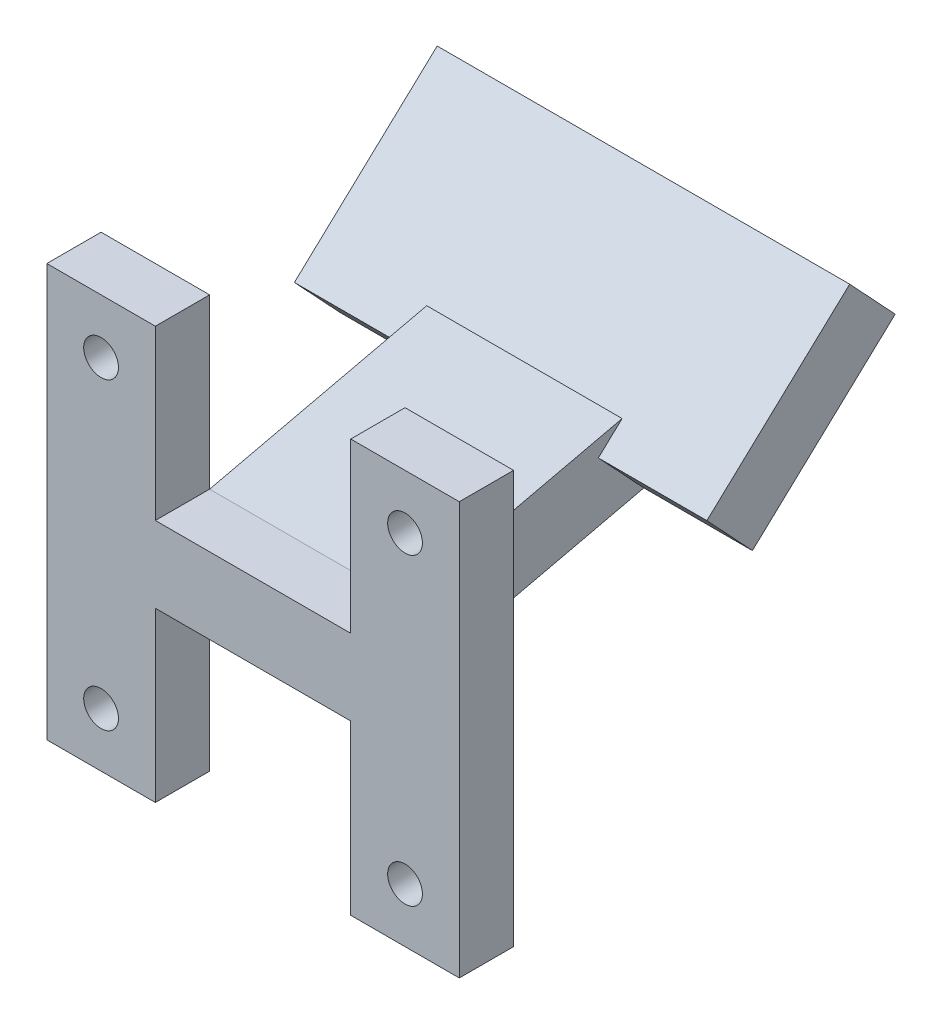
ISO-10303-21;
HEADER;
FILE_DESCRIPTION(('STEP AP214'),'2;1');
FILE_NAME('part.step','',(''),(''),'','','');
FILE_SCHEMA(('AUTOMOTIVE_DESIGN { 1 0 10303 214 1 1 1 1 }'));
ENDSEC;
DATA;
#1=APPLICATION_CONTEXT('core data for automotive mechanical design processes');
#2=APPLICATION_PROTOCOL_DEFINITION('international standard','automotive_design',2000,#1);
#3=PRODUCT_CONTEXT('',#1,'mechanical');
#4=PRODUCT('Part','Part','',(#3));
#5=PRODUCT_RELATED_PRODUCT_CATEGORY('part','',(#4));
#6=PRODUCT_DEFINITION_FORMATION('','',#4);
#7=PRODUCT_DEFINITION_CONTEXT('part definition',#1,'design');
#8=PRODUCT_DEFINITION('design','',#6,#7);
#9=PRODUCT_DEFINITION_SHAPE('','',#8);
#10=(LENGTH_UNIT() NAMED_UNIT(*) SI_UNIT(.MILLI.,.METRE.));
#11=(NAMED_UNIT(*) PLANE_ANGLE_UNIT() SI_UNIT($,.RADIAN.));
#12=(NAMED_UNIT(*) SI_UNIT($,.STERADIAN.) SOLID_ANGLE_UNIT());
#13=UNCERTAINTY_MEASURE_WITH_UNIT(LENGTH_MEASURE(1.E-05),#10,'distance_accuracy_value','');
#14=(GEOMETRIC_REPRESENTATION_CONTEXT(3) GLOBAL_UNCERTAINTY_ASSIGNED_CONTEXT((#13)) GLOBAL_UNIT_ASSIGNED_CONTEXT((#10,
#11,#12)) REPRESENTATION_CONTEXT('',''));
#15=CARTESIAN_POINT('',(0.,0.,0.));
#16=DIRECTION('',(0.,0.,1.));
#17=DIRECTION('',(1.,0.,0.));
#18=AXIS2_PLACEMENT_3D('',#15,#16,#17);
#19=CARTESIAN_POINT('',(0.,0.,0.));
#20=DIRECTION('',(0.,0.,-1.));
#21=DIRECTION('',(-1.,0.,0.));
#22=AXIS2_PLACEMENT_3D('',#19,#20,#21);
#23=PLANE('',#22);
#24=CARTESIAN_POINT('',(5.,4.99999999999999,0.));
#25=DIRECTION('',(0.,0.,1.));
#26=DIRECTION('',(1.,0.,0.));
#27=AXIS2_PLACEMENT_3D('',#24,#25,#26);
#28=CIRCLE('',#27,1.6);
#29=CARTESIAN_POINT('',(6.6,4.99999999999999,0.));
#30=VERTEX_POINT('',#29);
#31=EDGE_CURVE('E270',#30,#30,#28,.T.);
#32=ORIENTED_EDGE('',*,*,#31,.T.);
#33=EDGE_LOOP('',(#32));
#34=FACE_BOUND('',#33,.T.);
#35=CARTESIAN_POINT('',(5.,33.,0.));
#36=DIRECTION('',(0.,0.,1.));
#37=DIRECTION('',(1.,0.,0.));
#38=AXIS2_PLACEMENT_3D('',#35,#36,#37);
#39=CIRCLE('',#38,1.6);
#40=CARTESIAN_POINT('',(6.6,33.,0.));
#41=VERTEX_POINT('',#40);
#42=EDGE_CURVE('E274',#41,#41,#39,.T.);
#43=ORIENTED_EDGE('',*,*,#42,.T.);
#44=EDGE_LOOP('',(#43));
#45=FACE_BOUND('',#44,.T.);
#46=DIRECTION('',(0.,1.,0.));
#47=VECTOR('',#46,1.);
#48=CARTESIAN_POINT('',(10.,38.,0.));
#49=LINE('',#48,#47);
#50=CARTESIAN_POINT('',(10.,22.5,0.));
#51=VERTEX_POINT('',#50);
#52=CARTESIAN_POINT('',(10.,38.,0.));
#53=VERTEX_POINT('',#52);
#54=EDGE_CURVE('E152',#51,#53,#49,.T.);
#55=ORIENTED_EDGE('',*,*,#54,.F.);
#56=DIRECTION('',(0.,-1.,0.));
#57=VECTOR('',#56,1.);
#58=CARTESIAN_POINT('',(10.,22.5,0.));
#59=LINE('',#58,#57);
#60=CARTESIAN_POINT('',(10.,15.5,0.));
#61=VERTEX_POINT('',#60);
#62=EDGE_CURVE('E230',#51,#61,#59,.T.);
#63=ORIENTED_EDGE('',*,*,#62,.T.);
#64=DIRECTION('',(0.,1.,0.));
#65=VECTOR('',#64,1.);
#66=CARTESIAN_POINT('',(10.,15.5,0.));
#67=LINE('',#66,#65);
#68=CARTESIAN_POINT('',(10.,0.,0.));
#69=VERTEX_POINT('',#68);
#70=EDGE_CURVE('E167',#69,#61,#67,.T.);
#71=ORIENTED_EDGE('',*,*,#70,.F.);
#72=DIRECTION('',(1.,0.,0.));
#73=VECTOR('',#72,1.);
#74=CARTESIAN_POINT('',(10.,0.,0.));
#75=LINE('',#74,#73);
#76=CARTESIAN_POINT('',(0.,0.,0.));
#77=VERTEX_POINT('',#76);
#78=EDGE_CURVE('E164',#77,#69,#75,.T.);
#79=ORIENTED_EDGE('',*,*,#78,.F.);
#80=DIRECTION('',(0.,-1.,0.));
#81=VECTOR('',#80,1.);
#82=CARTESIAN_POINT('',(0.,0.,0.));
#83=LINE('',#82,#81);
#84=CARTESIAN_POINT('',(0.,38.,0.));
#85=VERTEX_POINT('',#84);
#86=EDGE_CURVE('E99',#85,#77,#83,.T.);
#87=ORIENTED_EDGE('',*,*,#86,.F.);
#88=DIRECTION('',(-1.,0.,0.));
#89=VECTOR('',#88,1.);
#90=CARTESIAN_POINT('',(0.,38.,0.));
#91=LINE('',#90,#89);
#92=EDGE_CURVE('E188',#53,#85,#91,.T.);
#93=ORIENTED_EDGE('',*,*,#92,.F.);
#94=EDGE_LOOP('',(#55,#63,#71,#79,#87,#93));
#95=FACE_BOUND('',#94,.T.);
#96=ADVANCED_FACE('F33',(#34,#45,#95),#23,.T.);
#97=CARTESIAN_POINT('',(0.,0.,5.));
#98=DIRECTION('',(0.,0.,-1.));
#99=DIRECTION('',(-1.,0.,0.));
#100=AXIS2_PLACEMENT_3D('',#97,#98,#99);
#101=PLANE('',#100);
#102=DIRECTION('',(1.,0.,0.));
#103=VECTOR('',#102,1.);
#104=CARTESIAN_POINT('',(10.,0.,5.));
#105=LINE('',#104,#103);
#106=CARTESIAN_POINT('',(0.,0.,5.));
#107=VERTEX_POINT('',#106);
#108=CARTESIAN_POINT('',(10.,0.,5.));
#109=VERTEX_POINT('',#108);
#110=EDGE_CURVE('E191',#107,#109,#105,.T.);
#111=ORIENTED_EDGE('',*,*,#110,.T.);
#112=DIRECTION('',(0.,1.,0.));
#113=VECTOR('',#112,1.);
#114=CARTESIAN_POINT('',(10.,15.5,5.));
#115=LINE('',#114,#113);
#116=CARTESIAN_POINT('',(10.,15.5,5.));
#117=VERTEX_POINT('',#116);
#118=EDGE_CURVE('E107',#109,#117,#115,.T.);
#119=ORIENTED_EDGE('',*,*,#118,.T.);
#120=DIRECTION('',(1.,0.,0.));
#121=VECTOR('',#120,1.);
#122=CARTESIAN_POINT('',(28.,15.5,5.));
#123=LINE('',#122,#121);
#124=CARTESIAN_POINT('',(28.,15.5,5.));
#125=VERTEX_POINT('',#124);
#126=EDGE_CURVE('E221',#117,#125,#123,.T.);
#127=ORIENTED_EDGE('',*,*,#126,.T.);
#128=DIRECTION('',(0.,-1.,0.));
#129=VECTOR('',#128,1.);
#130=CARTESIAN_POINT('',(28.,0.,5.));
#131=LINE('',#130,#129);
#132=CARTESIAN_POINT('',(28.,0.,5.));
#133=VERTEX_POINT('',#132);
#134=EDGE_CURVE('E296',#125,#133,#131,.T.);
#135=ORIENTED_EDGE('',*,*,#134,.T.);
#136=DIRECTION('',(1.,0.,0.));
#137=VECTOR('',#136,1.);
#138=CARTESIAN_POINT('',(38.,0.,5.));
#139=LINE('',#138,#137);
#140=CARTESIAN_POINT('',(38.,0.,5.));
#141=VERTEX_POINT('',#140);
#142=EDGE_CURVE('E298',#133,#141,#139,.T.);
#143=ORIENTED_EDGE('',*,*,#142,.T.);
#144=DIRECTION('',(0.,1.,0.));
#145=VECTOR('',#144,1.);
#146=CARTESIAN_POINT('',(38.,38.,5.));
#147=LINE('',#146,#145);
#148=CARTESIAN_POINT('',(38.,38.,5.));
#149=VERTEX_POINT('',#148);
#150=EDGE_CURVE('E300',#141,#149,#147,.T.);
#151=ORIENTED_EDGE('',*,*,#150,.T.);
#152=DIRECTION('',(-1.,0.,0.));
#153=VECTOR('',#152,1.);
#154=CARTESIAN_POINT('',(28.,38.,5.));
#155=LINE('',#154,#153);
#156=CARTESIAN_POINT('',(28.,38.,5.));
#157=VERTEX_POINT('',#156);
#158=EDGE_CURVE('E302',#149,#157,#155,.T.);
#159=ORIENTED_EDGE('',*,*,#158,.T.);
#160=DIRECTION('',(0.,-1.,0.));
#161=VECTOR('',#160,1.);
#162=CARTESIAN_POINT('',(28.,22.5,5.));
#163=LINE('',#162,#161);
#164=CARTESIAN_POINT('',(28.,22.5,5.));
#165=VERTEX_POINT('',#164);
#166=EDGE_CURVE('E304',#157,#165,#163,.T.);
#167=ORIENTED_EDGE('',*,*,#166,.T.);
#168=DIRECTION('',(-1.,0.,0.));
#169=VECTOR('',#168,1.);
#170=CARTESIAN_POINT('',(10.,22.5,5.));
#171=LINE('',#170,#169);
#172=CARTESIAN_POINT('',(10.,22.5,5.));
#173=VERTEX_POINT('',#172);
#174=EDGE_CURVE('E143',#165,#173,#171,.T.);
#175=ORIENTED_EDGE('',*,*,#174,.T.);
#176=DIRECTION('',(0.,1.,0.));
#177=VECTOR('',#176,1.);
#178=CARTESIAN_POINT('',(10.,38.,5.));
#179=LINE('',#178,#177);
#180=CARTESIAN_POINT('',(10.,38.,5.));
#181=VERTEX_POINT('',#180);
#182=EDGE_CURVE('E135',#173,#181,#179,.T.);
#183=ORIENTED_EDGE('',*,*,#182,.T.);
#184=DIRECTION('',(-1.,0.,0.));
#185=VECTOR('',#184,1.);
#186=CARTESIAN_POINT('',(0.,38.,5.));
#187=LINE('',#186,#185);
#188=CARTESIAN_POINT('',(0.,38.,5.));
#189=VERTEX_POINT('',#188);
#190=EDGE_CURVE('E140',#181,#189,#187,.T.);
#191=ORIENTED_EDGE('',*,*,#190,.T.);
#192=DIRECTION('',(0.,-1.,0.));
#193=VECTOR('',#192,1.);
#194=CARTESIAN_POINT('',(0.,0.,5.));
#195=LINE('',#194,#193);
#196=EDGE_CURVE('E57',#189,#107,#195,.T.);
#197=ORIENTED_EDGE('',*,*,#196,.T.);
#198=EDGE_LOOP('',(#111,#119,#127,#135,#143,#151,#159,#167,#175,#183,#191,#197));
#199=FACE_BOUND('',#198,.T.);
#200=CARTESIAN_POINT('',(33.,33.,5.));
#201=DIRECTION('',(0.,0.,1.));
#202=DIRECTION('',(1.,0.,0.));
#203=AXIS2_PLACEMENT_3D('',#200,#201,#202);
#204=CIRCLE('',#203,1.6);
#205=CARTESIAN_POINT('',(34.6,33.,5.));
#206=VERTEX_POINT('',#205);
#207=EDGE_CURVE('E168',#206,#206,#204,.T.);
#208=ORIENTED_EDGE('',*,*,#207,.F.);
#209=EDGE_LOOP('',(#208));
#210=FACE_BOUND('',#209,.T.);
#211=CARTESIAN_POINT('',(33.,4.99999999999999,5.));
#212=DIRECTION('',(0.,0.,1.));
#213=DIRECTION('',(1.,0.,0.));
#214=AXIS2_PLACEMENT_3D('',#211,#212,#213);
#215=CIRCLE('',#214,1.6);
#216=CARTESIAN_POINT('',(34.6,4.99999999999999,5.));
#217=VERTEX_POINT('',#216);
#218=EDGE_CURVE('E283',#217,#217,#215,.T.);
#219=ORIENTED_EDGE('',*,*,#218,.F.);
#220=EDGE_LOOP('',(#219));
#221=FACE_BOUND('',#220,.T.);
#222=CARTESIAN_POINT('',(5.,33.,5.));
#223=DIRECTION('',(0.,0.,1.));
#224=DIRECTION('',(1.,0.,0.));
#225=AXIS2_PLACEMENT_3D('',#222,#223,#224);
#226=CIRCLE('',#225,1.6);
#227=CARTESIAN_POINT('',(6.6,33.,5.));
#228=VERTEX_POINT('',#227);
#229=EDGE_CURVE('E277',#228,#228,#226,.T.);
#230=ORIENTED_EDGE('',*,*,#229,.F.);
#231=EDGE_LOOP('',(#230));
#232=FACE_BOUND('',#231,.T.);
#233=CARTESIAN_POINT('',(5.,4.99999999999999,5.));
#234=DIRECTION('',(0.,0.,1.));
#235=DIRECTION('',(1.,0.,0.));
#236=AXIS2_PLACEMENT_3D('',#233,#234,#235);
#237=CIRCLE('',#236,1.6);
#238=CARTESIAN_POINT('',(6.6,4.99999999999999,5.));
#239=VERTEX_POINT('',#238);
#240=EDGE_CURVE('E271',#239,#239,#237,.T.);
#241=ORIENTED_EDGE('',*,*,#240,.F.);
#242=EDGE_LOOP('',(#241));
#243=FACE_BOUND('',#242,.T.);
#244=ADVANCED_FACE('F137',(#199,#210,#221,#232,#243),#101,.F.);
#245=DIRECTION('',(0.,-1.,0.));
#246=VECTOR('',#245,1.);
#247=CARTESIAN_POINT('',(28.,22.5,0.));
#248=LINE('',#247,#246);
#249=CARTESIAN_POINT('',(28.,22.5,0.));
#250=VERTEX_POINT('',#249);
#251=CARTESIAN_POINT('',(28.,15.5,0.));
#252=VERTEX_POINT('',#251);
#253=EDGE_CURVE('E245',#250,#252,#248,.T.);
#254=ORIENTED_EDGE('',*,*,#253,.F.);
#255=DIRECTION('',(0.,-1.,0.));
#256=VECTOR('',#255,1.);
#257=CARTESIAN_POINT('',(28.,22.5,0.));
#258=LINE('',#257,#256);
#259=CARTESIAN_POINT('',(28.,38.,0.));
#260=VERTEX_POINT('',#259);
#261=EDGE_CURVE('E182',#260,#250,#258,.T.);
#262=ORIENTED_EDGE('',*,*,#261,.F.);
#263=DIRECTION('',(-1.,0.,0.));
#264=VECTOR('',#263,1.);
#265=CARTESIAN_POINT('',(28.,38.,0.));
#266=LINE('',#265,#264);
#267=CARTESIAN_POINT('',(38.,38.,0.));
#268=VERTEX_POINT('',#267);
#269=EDGE_CURVE('E180',#268,#260,#266,.T.);
#270=ORIENTED_EDGE('',*,*,#269,.F.);
#271=DIRECTION('',(0.,1.,0.));
#272=VECTOR('',#271,1.);
#273=CARTESIAN_POINT('',(38.,38.,0.));
#274=LINE('',#273,#272);
#275=CARTESIAN_POINT('',(38.,0.,0.));
#276=VERTEX_POINT('',#275);
#277=EDGE_CURVE('E178',#276,#268,#274,.T.);
#278=ORIENTED_EDGE('',*,*,#277,.F.);
#279=DIRECTION('',(1.,0.,0.));
#280=VECTOR('',#279,1.);
#281=CARTESIAN_POINT('',(38.,0.,0.));
#282=LINE('',#281,#280);
#283=CARTESIAN_POINT('',(28.,0.,0.));
#284=VERTEX_POINT('',#283);
#285=EDGE_CURVE('E176',#284,#276,#282,.T.);
#286=ORIENTED_EDGE('',*,*,#285,.F.);
#287=DIRECTION('',(0.,-1.,0.));
#288=VECTOR('',#287,1.);
#289=CARTESIAN_POINT('',(28.,0.,0.));
#290=LINE('',#289,#288);
#291=EDGE_CURVE('E174',#252,#284,#290,.T.);
#292=ORIENTED_EDGE('',*,*,#291,.F.);
#293=EDGE_LOOP('',(#254,#262,#270,#278,#286,#292));
#294=FACE_BOUND('',#293,.T.);
#295=CARTESIAN_POINT('',(33.,33.,0.));
#296=DIRECTION('',(0.,0.,1.));
#297=DIRECTION('',(1.,0.,0.));
#298=AXIS2_PLACEMENT_3D('',#295,#296,#297);
#299=CIRCLE('',#298,1.6);
#300=CARTESIAN_POINT('',(34.6,33.,0.));
#301=VERTEX_POINT('',#300);
#302=EDGE_CURVE('E286',#301,#301,#299,.T.);
#303=ORIENTED_EDGE('',*,*,#302,.T.);
#304=EDGE_LOOP('',(#303));
#305=FACE_BOUND('',#304,.T.);
#306=CARTESIAN_POINT('',(33.,4.99999999999999,0.));
#307=DIRECTION('',(0.,0.,1.));
#308=DIRECTION('',(1.,0.,0.));
#309=AXIS2_PLACEMENT_3D('',#306,#307,#308);
#310=CIRCLE('',#309,1.6);
#311=CARTESIAN_POINT('',(34.6,4.99999999999999,0.));
#312=VERTEX_POINT('',#311);
#313=EDGE_CURVE('E280',#312,#312,#310,.T.);
#314=ORIENTED_EDGE('',*,*,#313,.T.);
#315=EDGE_LOOP('',(#314));
#316=FACE_BOUND('',#315,.T.);
#317=ADVANCED_FACE('F337',(#294,#305,#316),#23,.T.);
#318=CARTESIAN_POINT('',(10.,0.,5.));
#319=DIRECTION('',(0.,1.,0.));
#320=DIRECTION('',(0.,0.,1.));
#321=AXIS2_PLACEMENT_3D('',#318,#319,#320);
#322=PLANE('',#321);
#323=ORIENTED_EDGE('',*,*,#78,.T.);
#324=DIRECTION('',(0.,0.,-1.));
#325=VECTOR('',#324,1.);
#326=CARTESIAN_POINT('',(10.,0.,5.));
#327=LINE('',#326,#325);
#328=EDGE_CURVE('E11',#109,#69,#327,.T.);
#329=ORIENTED_EDGE('',*,*,#328,.F.);
#330=ORIENTED_EDGE('',*,*,#110,.F.);
#331=DIRECTION('',(0.,0.,-1.));
#332=VECTOR('',#331,1.);
#333=CARTESIAN_POINT('',(0.,0.,5.));
#334=LINE('',#333,#332);
#335=EDGE_CURVE('E160',#107,#77,#334,.T.);
#336=ORIENTED_EDGE('',*,*,#335,.T.);
#337=EDGE_LOOP('',(#323,#329,#330,#336));
#338=FACE_BOUND('',#337,.T.);
#339=ADVANCED_FACE('F35',(#338),#322,.F.);
#340=CARTESIAN_POINT('',(10.,15.5,5.));
#341=DIRECTION('',(-1.,0.,0.));
#342=DIRECTION('',(0.,-1.,0.));
#343=AXIS2_PLACEMENT_3D('',#340,#341,#342);
#344=PLANE('',#343);
#345=ORIENTED_EDGE('',*,*,#70,.T.);
#346=DIRECTION('',(0.,0.,-1.));
#347=VECTOR('',#346,1.);
#348=CARTESIAN_POINT('',(10.,15.5,5.));
#349=LINE('',#348,#347);
#350=EDGE_CURVE('E41',#117,#61,#349,.T.);
#351=ORIENTED_EDGE('',*,*,#350,.F.);
#352=ORIENTED_EDGE('',*,*,#118,.F.);
#353=ORIENTED_EDGE('',*,*,#328,.T.);
#354=EDGE_LOOP('',(#345,#351,#352,#353));
#355=FACE_BOUND('',#354,.T.);
#356=ADVANCED_FACE('F387',(#355),#344,.F.);
#357=CARTESIAN_POINT('',(28.,15.5,5.));
#358=DIRECTION('',(0.,1.,0.));
#359=DIRECTION('',(-1.,0.,0.));
#360=AXIS2_PLACEMENT_3D('',#357,#358,#359);
#361=PLANE('',#360);
#362=DIRECTION('',(1.,0.,0.));
#363=VECTOR('',#362,1.);
#364=CARTESIAN_POINT('',(28.,15.5,0.));
#365=LINE('',#364,#363);
#366=EDGE_CURVE('E171',#61,#252,#365,.T.);
#367=ORIENTED_EDGE('',*,*,#366,.T.);
#368=DIRECTION('',(0.,0.,-1.));
#369=VECTOR('',#368,1.);
#370=CARTESIAN_POINT('',(28.,15.5,5.));
#371=LINE('',#370,#369);
#372=EDGE_CURVE('E210',#125,#252,#371,.T.);
#373=ORIENTED_EDGE('',*,*,#372,.F.);
#374=ORIENTED_EDGE('',*,*,#126,.F.);
#375=ORIENTED_EDGE('',*,*,#350,.T.);
#376=EDGE_LOOP('',(#367,#373,#374,#375));
#377=FACE_BOUND('',#376,.T.);
#378=ADVANCED_FACE('F216',(#377),#361,.F.);
#379=CARTESIAN_POINT('',(28.,0.,5.));
#380=DIRECTION('',(1.,0.,0.));
#381=DIRECTION('',(0.,1.,0.));
#382=AXIS2_PLACEMENT_3D('',#379,#380,#381);
#383=PLANE('',#382);
#384=ORIENTED_EDGE('',*,*,#291,.T.);
#385=DIRECTION('',(0.,0.,-1.));
#386=VECTOR('',#385,1.);
#387=CARTESIAN_POINT('',(28.,0.,5.));
#388=LINE('',#387,#386);
#389=EDGE_CURVE('E207',#133,#284,#388,.T.);
#390=ORIENTED_EDGE('',*,*,#389,.F.);
#391=ORIENTED_EDGE('',*,*,#134,.F.);
#392=ORIENTED_EDGE('',*,*,#372,.T.);
#393=EDGE_LOOP('',(#384,#390,#391,#392));
#394=FACE_BOUND('',#393,.T.);
#395=ADVANCED_FACE('F323',(#394),#383,.F.);
#396=CARTESIAN_POINT('',(38.,0.,5.));
#397=DIRECTION('',(0.,1.,0.));
#398=DIRECTION('',(-1.,0.,0.));
#399=AXIS2_PLACEMENT_3D('',#396,#397,#398);
#400=PLANE('',#399);
#401=ORIENTED_EDGE('',*,*,#285,.T.);
#402=DIRECTION('',(0.,0.,-1.));
#403=VECTOR('',#402,1.);
#404=CARTESIAN_POINT('',(38.,0.,5.));
#405=LINE('',#404,#403);
#406=EDGE_CURVE('E204',#141,#276,#405,.T.);
#407=ORIENTED_EDGE('',*,*,#406,.F.);
#408=ORIENTED_EDGE('',*,*,#142,.F.);
#409=ORIENTED_EDGE('',*,*,#389,.T.);
#410=EDGE_LOOP('',(#401,#407,#408,#409));
#411=FACE_BOUND('',#410,.T.);
#412=ADVANCED_FACE('F328',(#411),#400,.F.);
#413=CARTESIAN_POINT('',(38.,38.,5.));
#414=DIRECTION('',(-1.,0.,0.));
#415=DIRECTION('',(0.,-1.,0.));
#416=AXIS2_PLACEMENT_3D('',#413,#414,#415);
#417=PLANE('',#416);
#418=ORIENTED_EDGE('',*,*,#277,.T.);
#419=DIRECTION('',(0.,0.,-1.));
#420=VECTOR('',#419,1.);
#421=CARTESIAN_POINT('',(38.,38.,5.));
#422=LINE('',#421,#420);
#423=EDGE_CURVE('E201',#149,#268,#422,.T.);
#424=ORIENTED_EDGE('',*,*,#423,.F.);
#425=ORIENTED_EDGE('',*,*,#150,.F.);
#426=ORIENTED_EDGE('',*,*,#406,.T.);
#427=EDGE_LOOP('',(#418,#424,#425,#426));
#428=FACE_BOUND('',#427,.T.);
#429=ADVANCED_FACE('F332',(#428),#417,.F.);
#430=CARTESIAN_POINT('',(28.,38.,5.));
#431=DIRECTION('',(0.,-1.,0.));
#432=DIRECTION('',(1.,0.,0.));
#433=AXIS2_PLACEMENT_3D('',#430,#431,#432);
#434=PLANE('',#433);
#435=ORIENTED_EDGE('',*,*,#269,.T.);
#436=DIRECTION('',(0.,0.,-1.));
#437=VECTOR('',#436,1.);
#438=CARTESIAN_POINT('',(28.,38.,5.));
#439=LINE('',#438,#437);
#440=EDGE_CURVE('E198',#157,#260,#439,.T.);
#441=ORIENTED_EDGE('',*,*,#440,.F.);
#442=ORIENTED_EDGE('',*,*,#158,.F.);
#443=ORIENTED_EDGE('',*,*,#423,.T.);
#444=EDGE_LOOP('',(#435,#441,#442,#443));
#445=FACE_BOUND('',#444,.T.);
#446=ADVANCED_FACE('F336',(#445),#434,.F.);
#447=CARTESIAN_POINT('',(28.,22.5,5.));
#448=DIRECTION('',(1.,0.,0.));
#449=DIRECTION('',(0.,0.,-1.));
#450=AXIS2_PLACEMENT_3D('',#447,#448,#449);
#451=PLANE('',#450);
#452=ORIENTED_EDGE('',*,*,#261,.T.);
#453=DIRECTION('',(0.,0.,-1.));
#454=VECTOR('',#453,1.);
#455=CARTESIAN_POINT('',(28.,22.5,5.));
#456=LINE('',#455,#454);
#457=EDGE_CURVE('E195',#165,#250,#456,.T.);
#458=ORIENTED_EDGE('',*,*,#457,.F.);
#459=ORIENTED_EDGE('',*,*,#166,.F.);
#460=ORIENTED_EDGE('',*,*,#440,.T.);
#461=EDGE_LOOP('',(#452,#458,#459,#460));
#462=FACE_BOUND('',#461,.T.);
#463=ADVANCED_FACE('F310',(#462),#451,.F.);
#464=CARTESIAN_POINT('',(10.,22.5,5.));
#465=DIRECTION('',(0.,-1.,0.));
#466=DIRECTION('',(1.,0.,0.));
#467=AXIS2_PLACEMENT_3D('',#464,#465,#466);
#468=PLANE('',#467);
#469=DIRECTION('',(-1.,0.,0.));
#470=VECTOR('',#469,1.);
#471=CARTESIAN_POINT('',(10.,22.5,0.));
#472=LINE('',#471,#470);
#473=EDGE_CURVE('E185',#250,#51,#472,.T.);
#474=ORIENTED_EDGE('',*,*,#473,.T.);
#475=DIRECTION('',(0.,0.,-1.));
#476=VECTOR('',#475,1.);
#477=CARTESIAN_POINT('',(10.,22.5,5.));
#478=LINE('',#477,#476);
#479=EDGE_CURVE('E155',#173,#51,#478,.T.);
#480=ORIENTED_EDGE('',*,*,#479,.F.);
#481=ORIENTED_EDGE('',*,*,#174,.F.);
#482=ORIENTED_EDGE('',*,*,#457,.T.);
#483=EDGE_LOOP('',(#474,#480,#481,#482));
#484=FACE_BOUND('',#483,.T.);
#485=ADVANCED_FACE('F313',(#484),#468,.F.);
#486=CARTESIAN_POINT('',(10.,38.,5.));
#487=DIRECTION('',(-1.,0.,0.));
#488=DIRECTION('',(0.,-1.,0.));
#489=AXIS2_PLACEMENT_3D('',#486,#487,#488);
#490=PLANE('',#489);
#491=ORIENTED_EDGE('',*,*,#54,.T.);
#492=DIRECTION('',(0.,0.,-1.));
#493=VECTOR('',#492,1.);
#494=CARTESIAN_POINT('',(10.,38.,5.));
#495=LINE('',#494,#493);
#496=EDGE_CURVE('E149',#181,#53,#495,.T.);
#497=ORIENTED_EDGE('',*,*,#496,.F.);
#498=ORIENTED_EDGE('',*,*,#182,.F.);
#499=ORIENTED_EDGE('',*,*,#479,.T.);
#500=EDGE_LOOP('',(#491,#497,#498,#499));
#501=FACE_BOUND('',#500,.T.);
#502=ADVANCED_FACE('F150',(#501),#490,.F.);
#503=CARTESIAN_POINT('',(0.,38.,5.));
#504=DIRECTION('',(0.,-1.,0.));
#505=DIRECTION('',(0.,0.,-1.));
#506=AXIS2_PLACEMENT_3D('',#503,#504,#505);
#507=PLANE('',#506);
#508=ORIENTED_EDGE('',*,*,#92,.T.);
#509=DIRECTION('',(0.,0.,-1.));
#510=VECTOR('',#509,1.);
#511=CARTESIAN_POINT('',(0.,38.,5.));
#512=LINE('',#511,#510);
#513=EDGE_CURVE('E156',#189,#85,#512,.T.);
#514=ORIENTED_EDGE('',*,*,#513,.F.);
#515=ORIENTED_EDGE('',*,*,#190,.F.);
#516=ORIENTED_EDGE('',*,*,#496,.T.);
#517=EDGE_LOOP('',(#508,#514,#515,#516));
#518=FACE_BOUND('',#517,.T.);
#519=ADVANCED_FACE('F158',(#518),#507,.F.);
#520=CARTESIAN_POINT('',(0.,0.,5.));
#521=DIRECTION('',(1.,0.,0.));
#522=DIRECTION('',(0.,0.,-1.));
#523=AXIS2_PLACEMENT_3D('',#520,#521,#522);
#524=PLANE('',#523);
#525=ORIENTED_EDGE('',*,*,#86,.T.);
#526=ORIENTED_EDGE('',*,*,#335,.F.);
#527=ORIENTED_EDGE('',*,*,#196,.F.);
#528=ORIENTED_EDGE('',*,*,#513,.T.);
#529=EDGE_LOOP('',(#525,#526,#527,#528));
#530=FACE_BOUND('',#529,.T.);
#531=ADVANCED_FACE('F316',(#530),#524,.F.);
#532=CARTESIAN_POINT('',(33.,33.,5.));
#533=DIRECTION('',(0.,0.,-1.));
#534=DIRECTION('',(-1.,0.,0.));
#535=AXIS2_PLACEMENT_3D('',#532,#533,#534);
#536=CYLINDRICAL_SURFACE('',#535,1.6);
#537=ORIENTED_EDGE('',*,*,#207,.T.);
#538=EDGE_LOOP('',(#537));
#539=FACE_BOUND('',#538,.T.);
#540=ORIENTED_EDGE('',*,*,#302,.F.);
#541=EDGE_LOOP('',(#540));
#542=FACE_BOUND('',#541,.T.);
#543=ADVANCED_FACE('F348',(#539,#542),#536,.F.);
#544=CARTESIAN_POINT('',(33.,4.99999999999999,5.));
#545=DIRECTION('',(0.,0.,-1.));
#546=DIRECTION('',(-1.,0.,0.));
#547=AXIS2_PLACEMENT_3D('',#544,#545,#546);
#548=CYLINDRICAL_SURFACE('',#547,1.6);
#549=ORIENTED_EDGE('',*,*,#218,.T.);
#550=EDGE_LOOP('',(#549));
#551=FACE_BOUND('',#550,.T.);
#552=ORIENTED_EDGE('',*,*,#313,.F.);
#553=EDGE_LOOP('',(#552));
#554=FACE_BOUND('',#553,.T.);
#555=ADVANCED_FACE('F345',(#551,#554),#548,.F.);
#556=CARTESIAN_POINT('',(5.,33.,5.));
#557=DIRECTION('',(0.,0.,-1.));
#558=DIRECTION('',(-1.,0.,0.));
#559=AXIS2_PLACEMENT_3D('',#556,#557,#558);
#560=CYLINDRICAL_SURFACE('',#559,1.6);
#561=ORIENTED_EDGE('',*,*,#229,.T.);
#562=EDGE_LOOP('',(#561));
#563=FACE_BOUND('',#562,.T.);
#564=ORIENTED_EDGE('',*,*,#42,.F.);
#565=EDGE_LOOP('',(#564));
#566=FACE_BOUND('',#565,.T.);
#567=ADVANCED_FACE('F347',(#563,#566),#560,.F.);
#568=CARTESIAN_POINT('',(5.,4.99999999999999,5.));
#569=DIRECTION('',(0.,0.,-1.));
#570=DIRECTION('',(-1.,0.,0.));
#571=AXIS2_PLACEMENT_3D('',#568,#569,#570);
#572=CYLINDRICAL_SURFACE('',#571,1.6);
#573=ORIENTED_EDGE('',*,*,#240,.T.);
#574=EDGE_LOOP('',(#573));
#575=FACE_BOUND('',#574,.T.);
#576=ORIENTED_EDGE('',*,*,#31,.F.);
#577=EDGE_LOOP('',(#576));
#578=FACE_BOUND('',#577,.T.);
#579=ADVANCED_FACE('F355',(#575,#578),#572,.F.);
#580=CARTESIAN_POINT('',(10.,38.,5.));
#581=DIRECTION('',(-1.,0.,0.));
#582=DIRECTION('',(0.,-1.,0.));
#583=AXIS2_PLACEMENT_3D('',#580,#581,#582);
#584=PLANE('',#583);
#585=DIRECTION('',(0.,0.682561042892353,-0.730828586417981));
#586=VECTOR('',#585,1.);
#587=CARTESIAN_POINT('',(10.,4.51562550167918,4.21739120365314));
#588=LINE('',#587,#586);
#589=CARTESIAN_POINT('',(10.,25.0858969841039,-17.807514240746));
#590=VERTEX_POINT('',#589);
#591=CARTESIAN_POINT('',(10.,27.133580112781,-20.));
#592=VERTEX_POINT('',#591);
#593=EDGE_CURVE('E683',#590,#592,#588,.T.);
#594=ORIENTED_EDGE('',*,*,#593,.F.);
#595=DIRECTION('',(0.,-0.730828586417981,-0.682561042892353));
#596=VECTOR('',#595,1.);
#597=CARTESIAN_POINT('',(10.,40.1345786285437,-3.75272214821398));
#598=LINE('',#597,#596);
#599=CARTESIAN_POINT('',(10.,20.5969381240591,-22.));
#600=VERTEX_POINT('',#599);
#601=EDGE_CURVE('E234',#590,#600,#598,.T.);
#602=ORIENTED_EDGE('',*,*,#601,.T.);
#603=DIRECTION('',(0.,0.225700909569385,-0.974196643096019));
#604=VECTOR('',#603,1.);
#605=CARTESIAN_POINT('',(10.,14.7572009618321,3.20615601797427));
#606=LINE('',#605,#604);
#607=EDGE_CURVE('E226',#61,#600,#606,.T.);
#608=ORIENTED_EDGE('',*,*,#607,.F.);
#609=ORIENTED_EDGE('',*,*,#62,.F.);
#610=DIRECTION('',(0.,-0.225700909569385,0.974196643096019));
#611=VECTOR('',#610,1.);
#612=CARTESIAN_POINT('',(10.,21.4006146577689,4.74529549709776));
#613=LINE('',#612,#611);
#614=EDGE_CURVE('E244',#592,#51,#613,.T.);
#615=ORIENTED_EDGE('',*,*,#614,.F.);
#616=EDGE_LOOP('',(#594,#602,#608,#609,#615));
#617=FACE_BOUND('',#616,.T.);
#618=ADVANCED_FACE('F228',(#617),#584,.T.);
#619=CARTESIAN_POINT('',(28.,0.,0.));
#620=DIRECTION('',(-1.,0.,0.));
#621=DIRECTION('',(0.,0.,1.));
#622=AXIS2_PLACEMENT_3D('',#619,#620,#621);
#623=PLANE('',#622);
#624=DIRECTION('',(0.,-0.730828586417981,-0.682561042892353));
#625=VECTOR('',#624,1.);
#626=CARTESIAN_POINT('',(28.,40.1345786285437,-3.75272214821398));
#627=LINE('',#626,#625);
#628=CARTESIAN_POINT('',(28.,25.0858969841039,-17.8075142407461));
#629=VERTEX_POINT('',#628);
#630=CARTESIAN_POINT('',(28.,20.5969381240591,-22.));
#631=VERTEX_POINT('',#630);
#632=EDGE_CURVE('E48',#629,#631,#627,.T.);
#633=ORIENTED_EDGE('',*,*,#632,.F.);
#634=DIRECTION('',(0.,-0.682561042892353,0.730828586417981));
#635=VECTOR('',#634,1.);
#636=CARTESIAN_POINT('',(28.,4.51562550167918,4.21739120365315));
#637=LINE('',#636,#635);
#638=CARTESIAN_POINT('',(28.,27.133580112781,-20.));
#639=VERTEX_POINT('',#638);
#640=EDGE_CURVE('E651',#639,#629,#637,.T.);
#641=ORIENTED_EDGE('',*,*,#640,.F.);
#642=DIRECTION('',(0.,-0.225700909569385,0.974196643096019));
#643=VECTOR('',#642,1.);
#644=CARTESIAN_POINT('',(28.,21.4006146577689,4.74529549709776));
#645=LINE('',#644,#643);
#646=EDGE_CURVE('E250',#639,#250,#645,.T.);
#647=ORIENTED_EDGE('',*,*,#646,.T.);
#648=ORIENTED_EDGE('',*,*,#253,.T.);
#649=DIRECTION('',(0.,0.225700909569385,-0.974196643096019));
#650=VECTOR('',#649,1.);
#651=CARTESIAN_POINT('',(28.,14.7572009618321,3.20615601797427));
#652=LINE('',#651,#650);
#653=EDGE_CURVE('E241',#252,#631,#652,.T.);
#654=ORIENTED_EDGE('',*,*,#653,.T.);
#655=EDGE_LOOP('',(#633,#641,#647,#648,#654));
#656=FACE_BOUND('',#655,.T.);
#657=ADVANCED_FACE('F248',(#656),#623,.F.);
#658=CARTESIAN_POINT('',(-31.4035290254819,21.4006146577689,4.74529549709776));
#659=DIRECTION('',(0.,0.974196643096019,0.225700909569385));
#660=DIRECTION('',(0.,-0.225700909569385,0.974196643096019));
#661=AXIS2_PLACEMENT_3D('',#658,#659,#660);
#662=PLANE('',#661);
#663=DIRECTION('',(1.,0.,0.));
#664=VECTOR('',#663,1.);
#665=CARTESIAN_POINT('',(-31.4035290254819,27.133580112781,-20.));
#666=LINE('',#665,#664);
#667=EDGE_CURVE('E263',#592,#639,#666,.T.);
#668=ORIENTED_EDGE('',*,*,#667,.F.);
#669=ORIENTED_EDGE('',*,*,#614,.T.);
#670=ORIENTED_EDGE('',*,*,#473,.F.);
#671=ORIENTED_EDGE('',*,*,#646,.F.);
#672=EDGE_LOOP('',(#668,#669,#670,#671));
#673=FACE_BOUND('',#672,.T.);
#674=ADVANCED_FACE('F503',(#673),#662,.T.);
#675=CARTESIAN_POINT('',(-31.4035290254819,14.7572009618321,3.20615601797427));
#676=DIRECTION('',(0.,-0.974196643096019,-0.225700909569385));
#677=DIRECTION('',(0.,0.225700909569385,-0.974196643096019));
#678=AXIS2_PLACEMENT_3D('',#675,#676,#677);
#679=PLANE('',#678);
#680=ORIENTED_EDGE('',*,*,#366,.F.);
#681=ORIENTED_EDGE('',*,*,#607,.T.);
#682=DIRECTION('',(1.,0.,0.));
#683=VECTOR('',#682,1.);
#684=CARTESIAN_POINT('',(-31.4035290254819,20.5969381240591,-22.));
#685=LINE('',#684,#683);
#686=EDGE_CURVE('E238',#600,#631,#685,.T.);
#687=ORIENTED_EDGE('',*,*,#686,.T.);
#688=ORIENTED_EDGE('',*,*,#653,.F.);
#689=EDGE_LOOP('',(#680,#681,#687,#688));
#690=FACE_BOUND('',#689,.T.);
#691=ADVANCED_FACE('F240',(#690),#679,.T.);
#692=CARTESIAN_POINT('',(-31.4035290254819,8.01500651970099,-8.52833268969481));
#693=DIRECTION('',(0.,-0.73082858641798,-0.682561042892353));
#694=DIRECTION('',(0.,0.682561042892353,-0.730828586417981));
#695=AXIS2_PLACEMENT_3D('',#692,#693,#694);
#696=PLANE('',#695);
#697=CARTESIAN_POINT('',(4.99999999999999,29.4702316816597,-31.5007716234338));
#698=DIRECTION('',(0.,-0.730828586417981,-0.682561042892353));
#699=DIRECTION('',(0.,0.682561042892353,-0.730828586417981));
#700=AXIS2_PLACEMENT_3D('',#697,#698,#699);
#701=CIRCLE('',#700,2.);
#702=CARTESIAN_POINT('',(4.99999999999999,30.8353537674444,-32.9624287962697));
#703=VERTEX_POINT('',#702);
#704=EDGE_CURVE('E652',#703,#703,#701,.T.);
#705=ORIENTED_EDGE('',*,*,#704,.F.);
#706=EDGE_LOOP('',(#705));
#707=FACE_BOUND('',#706,.T.);
#708=CARTESIAN_POINT('',(33.,29.4702316816597,-31.5007716234338));
#709=DIRECTION('',(0.,-0.730828586417981,-0.682561042892353));
#710=DIRECTION('',(0.,0.682561042892353,-0.730828586417981));
#711=AXIS2_PLACEMENT_3D('',#708,#709,#710);
#712=CIRCLE('',#711,2.);
#713=CARTESIAN_POINT('',(33.,30.8353537674444,-32.9624287962697));
#714=VERTEX_POINT('',#713);
#715=EDGE_CURVE('E662',#714,#714,#712,.T.);
#716=ORIENTED_EDGE('',*,*,#715,.F.);
#717=EDGE_LOOP('',(#716));
#718=FACE_BOUND('',#717,.T.);
#719=ORIENTED_EDGE('',*,*,#686,.F.);
#720=DIRECTION('',(-1.,0.,0.));
#721=VECTOR('',#720,1.);
#722=CARTESIAN_POINT('',(0.,20.5969381240591,-22.));
#723=LINE('',#722,#721);
#724=CARTESIAN_POINT('',(0.,20.5969381240591,-22.));
#725=VERTEX_POINT('',#724);
#726=EDGE_CURVE('E684',#600,#725,#723,.T.);
#727=ORIENTED_EDGE('',*,*,#726,.T.);
#728=DIRECTION('',(0.,0.682561042892353,-0.730828586417981));
#729=VECTOR('',#728,1.);
#730=CARTESIAN_POINT('',(0.,0.0266666416343468,0.0249054443991965));
#731=LINE('',#730,#729);
#732=CARTESIAN_POINT('',(0.,32.8830368961214,-35.1549145555237));
#733=VERTEX_POINT('',#732);
#734=EDGE_CURVE('E687',#725,#733,#731,.T.);
#735=ORIENTED_EDGE('',*,*,#734,.T.);
#736=DIRECTION('',(1.,0.,0.));
#737=VECTOR('',#736,1.);
#738=CARTESIAN_POINT('',(-31.4035290254819,32.8830368961214,-35.1549145555237));
#739=LINE('',#738,#737);
#740=CARTESIAN_POINT('',(38.,32.8830368961214,-35.1549145555236));
#741=VERTEX_POINT('',#740);
#742=EDGE_CURVE('E264',#733,#741,#739,.T.);
#743=ORIENTED_EDGE('',*,*,#742,.T.);
#744=DIRECTION('',(0.,-0.682561042892353,0.730828586417981));
#745=VECTOR('',#744,1.);
#746=CARTESIAN_POINT('',(38.,0.0266666416343507,0.0249054443992001));
#747=LINE('',#746,#745);
#748=CARTESIAN_POINT('',(38.,20.5969381240591,-22.));
#749=VERTEX_POINT('',#748);
#750=EDGE_CURVE('E654',#741,#749,#747,.T.);
#751=ORIENTED_EDGE('',*,*,#750,.T.);
#752=DIRECTION('',(-1.,0.,0.));
#753=VECTOR('',#752,1.);
#754=CARTESIAN_POINT('',(0.,20.5969381240591,-22.));
#755=LINE('',#754,#753);
#756=EDGE_CURVE('E665',#749,#631,#755,.T.);
#757=ORIENTED_EDGE('',*,*,#756,.T.);
#758=EDGE_LOOP('',(#719,#727,#735,#743,#751,#757));
#759=FACE_BOUND('',#758,.T.);
#760=ADVANCED_FACE('F519',(#707,#718,#759),#696,.T.);
#761=CARTESIAN_POINT('',(-31.4035290254819,47.3680303764204,-21.6265818658289));
#762=DIRECTION('',(0.,0.682561042892352,-0.730828586417982));
#763=DIRECTION('',(0.,0.730828586417982,0.682561042892352));
#764=AXIS2_PLACEMENT_3D('',#761,#762,#763);
#765=PLANE('',#764);
#766=ORIENTED_EDGE('',*,*,#742,.F.);
#767=DIRECTION('',(0.,-0.730828586417981,-0.682561042892353));
#768=VECTOR('',#767,1.);
#769=CARTESIAN_POINT('',(0.,52.420677400606,-16.9076367037376));
#770=LINE('',#769,#768);
#771=CARTESIAN_POINT('',(0.,37.3719957561663,-30.9624287962697));
#772=VERTEX_POINT('',#771);
#773=EDGE_CURVE('E254',#772,#733,#770,.T.);
#774=ORIENTED_EDGE('',*,*,#773,.F.);
#775=DIRECTION('',(1.,0.,0.));
#776=VECTOR('',#775,1.);
#777=CARTESIAN_POINT('',(-31.4035290254819,37.3719957561662,-30.9624287962697));
#778=LINE('',#777,#776);
#779=CARTESIAN_POINT('',(38.,37.3719957561663,-30.9624287962697));
#780=VERTEX_POINT('',#779);
#781=EDGE_CURVE('E260',#772,#780,#778,.T.);
#782=ORIENTED_EDGE('',*,*,#781,.T.);
#783=DIRECTION('',(0.,-0.730828586417981,-0.682561042892353));
#784=VECTOR('',#783,1.);
#785=CARTESIAN_POINT('',(38.,52.420677400606,-16.9076367037376));
#786=LINE('',#785,#784);
#787=EDGE_CURVE('E676',#780,#741,#786,.T.);
#788=ORIENTED_EDGE('',*,*,#787,.T.);
#789=EDGE_LOOP('',(#766,#774,#782,#788));
#790=FACE_BOUND('',#789,.T.);
#791=ADVANCED_FACE('F528',(#790),#765,.T.);
#792=CARTESIAN_POINT('',(-31.4035290254819,12.5039653797458,-4.33584693044086));
#793=DIRECTION('',(0.,0.730828586417981,0.682561042892352));
#794=DIRECTION('',(0.,-0.682561042892353,0.730828586417981));
#795=AXIS2_PLACEMENT_3D('',#792,#793,#794);
#796=PLANE('',#795);
#797=ORIENTED_EDGE('',*,*,#781,.F.);
#798=DIRECTION('',(0.,0.682561042892353,-0.730828586417981));
#799=VECTOR('',#798,1.);
#800=CARTESIAN_POINT('',(0.,4.51562550167918,4.21739120365314));
#801=LINE('',#800,#799);
#802=CARTESIAN_POINT('',(0.,25.0858969841039,-17.8075142407461));
#803=VERTEX_POINT('',#802);
#804=EDGE_CURVE('E690',#803,#772,#801,.T.);
#805=ORIENTED_EDGE('',*,*,#804,.F.);
#806=DIRECTION('',(-1.,0.,0.));
#807=VECTOR('',#806,1.);
#808=CARTESIAN_POINT('',(0.,25.0858969841039,-17.8075142407461));
#809=LINE('',#808,#807);
#810=EDGE_CURVE('E694',#590,#803,#809,.T.);
#811=ORIENTED_EDGE('',*,*,#810,.F.);
#812=ORIENTED_EDGE('',*,*,#593,.T.);
#813=ORIENTED_EDGE('',*,*,#667,.T.);
#814=ORIENTED_EDGE('',*,*,#640,.T.);
#815=DIRECTION('',(-1.,0.,0.));
#816=VECTOR('',#815,1.);
#817=CARTESIAN_POINT('',(0.,25.0858969841039,-17.8075142407461));
#818=LINE('',#817,#816);
#819=CARTESIAN_POINT('',(38.,25.0858969841039,-17.8075142407461));
#820=VERTEX_POINT('',#819);
#821=EDGE_CURVE('E668',#820,#629,#818,.T.);
#822=ORIENTED_EDGE('',*,*,#821,.F.);
#823=DIRECTION('',(0.,-0.682561042892353,0.730828586417981));
#824=VECTOR('',#823,1.);
#825=CARTESIAN_POINT('',(38.,4.51562550167918,4.21739120365315));
#826=LINE('',#825,#824);
#827=EDGE_CURVE('E673',#780,#820,#826,.T.);
#828=ORIENTED_EDGE('',*,*,#827,.F.);
#829=EDGE_LOOP('',(#797,#805,#811,#812,#813,#814,#822,#828));
#830=FACE_BOUND('',#829,.T.);
#831=ADVANCED_FACE('F539',(#830),#796,.T.);
#832=CARTESIAN_POINT('',(0.,40.1345786285437,-3.75272214821399));
#833=DIRECTION('',(0.,-0.682561042892353,0.730828586417981));
#834=DIRECTION('',(0.,-0.730828586417981,-0.682561042892353));
#835=AXIS2_PLACEMENT_3D('',#832,#833,#834);
#836=PLANE('',#835);
#837=ORIENTED_EDGE('',*,*,#601,.F.);
#838=ORIENTED_EDGE('',*,*,#810,.T.);
#839=DIRECTION('',(0.,-0.730828586417981,-0.682561042892353));
#840=VECTOR('',#839,1.);
#841=CARTESIAN_POINT('',(0.,40.1345786285437,-3.75272214821399));
#842=LINE('',#841,#840);
#843=EDGE_CURVE('E693',#803,#725,#842,.T.);
#844=ORIENTED_EDGE('',*,*,#843,.T.);
#845=ORIENTED_EDGE('',*,*,#726,.F.);
#846=EDGE_LOOP('',(#837,#838,#844,#845));
#847=FACE_BOUND('',#846,.T.);
#848=ADVANCED_FACE('F549',(#847),#836,.T.);
#849=CARTESIAN_POINT('',(0.,19.564307146119,18.2721832961852));
#850=DIRECTION('',(-1.,0.,0.));
#851=DIRECTION('',(0.,-1.,0.));
#852=AXIS2_PLACEMENT_3D('',#849,#850,#851);
#853=PLANE('',#852);
#854=ORIENTED_EDGE('',*,*,#843,.F.);
#855=ORIENTED_EDGE('',*,*,#804,.T.);
#856=ORIENTED_EDGE('',*,*,#773,.T.);
#857=ORIENTED_EDGE('',*,*,#734,.F.);
#858=EDGE_LOOP('',(#854,#855,#856,#857));
#859=FACE_BOUND('',#858,.T.);
#860=ADVANCED_FACE('F569',(#859),#853,.T.);
#861=CARTESIAN_POINT('',(0.,40.1345786285437,-3.75272214821399));
#862=DIRECTION('',(0.,-0.682561042892353,0.730828586417981));
#863=DIRECTION('',(0.,-0.730828586417981,-0.682561042892353));
#864=AXIS2_PLACEMENT_3D('',#861,#862,#863);
#865=PLANE('',#864);
#866=DIRECTION('',(0.,-0.730828586417981,-0.682561042892353));
#867=VECTOR('',#866,1.);
#868=CARTESIAN_POINT('',(38.,40.1345786285437,-3.75272214821398));
#869=LINE('',#868,#867);
#870=EDGE_CURVE('E675',#820,#749,#869,.T.);
#871=ORIENTED_EDGE('',*,*,#870,.F.);
#872=ORIENTED_EDGE('',*,*,#821,.T.);
#873=ORIENTED_EDGE('',*,*,#632,.T.);
#874=ORIENTED_EDGE('',*,*,#756,.F.);
#875=EDGE_LOOP('',(#871,#872,#873,#874));
#876=FACE_BOUND('',#875,.T.);
#877=ADVANCED_FACE('F579',(#876),#865,.T.);
#878=CARTESIAN_POINT('',(38.,19.564307146119,18.2721832961852));
#879=DIRECTION('',(1.,0.,0.));
#880=DIRECTION('',(0.,1.,0.));
#881=AXIS2_PLACEMENT_3D('',#878,#879,#880);
#882=PLANE('',#881);
#883=ORIENTED_EDGE('',*,*,#787,.F.);
#884=ORIENTED_EDGE('',*,*,#827,.T.);
#885=ORIENTED_EDGE('',*,*,#870,.T.);
#886=ORIENTED_EDGE('',*,*,#750,.F.);
#887=EDGE_LOOP('',(#883,#884,#885,#886));
#888=FACE_BOUND('',#887,.T.);
#889=ADVANCED_FACE('F589',(#888),#882,.T.);
#890=CARTESIAN_POINT('',(33.,33.1243746137496,-28.087966408972));
#891=DIRECTION('',(0.,-0.730828586417981,-0.682561042892353));
#892=DIRECTION('',(0.,0.682561042892353,-0.730828586417981));
#893=AXIS2_PLACEMENT_3D('',#890,#891,#892);
#894=CYLINDRICAL_SURFACE('',#893,2.);
#895=CARTESIAN_POINT('',(33.,33.1243746137496,-28.087966408972));
#896=DIRECTION('',(0.,-0.730828586417981,-0.682561042892353));
#897=DIRECTION('',(0.,0.682561042892353,-0.730828586417981));
#898=AXIS2_PLACEMENT_3D('',#895,#896,#897);
#899=CIRCLE('',#898,2.);
#900=CARTESIAN_POINT('',(33.,34.4894966995343,-29.549623581808));
#901=VERTEX_POINT('',#900);
#902=EDGE_CURVE('E657',#901,#901,#899,.T.);
#903=ORIENTED_EDGE('',*,*,#902,.F.);
#904=EDGE_LOOP('',(#903));
#905=FACE_BOUND('',#904,.T.);
#906=ORIENTED_EDGE('',*,*,#715,.T.);
#907=EDGE_LOOP('',(#906));
#908=FACE_BOUND('',#907,.T.);
#909=ADVANCED_FACE('F599',(#905,#908),#894,.F.);
#910=CARTESIAN_POINT('',(33.,33.1243746137496,-28.087966408972));
#911=DIRECTION('',(0.,-0.730828586417981,-0.682561042892353));
#912=DIRECTION('',(0.,0.682561042892353,-0.730828586417981));
#913=AXIS2_PLACEMENT_3D('',#910,#911,#912);
#914=PLANE('',#913);
#915=ORIENTED_EDGE('',*,*,#902,.T.);
#916=EDGE_LOOP('',(#915));
#917=FACE_BOUND('',#916,.T.);
#918=ADVANCED_FACE('F614',(#917),#914,.T.);
#919=CARTESIAN_POINT('',(4.99999999999999,33.1243746137496,-28.087966408972));
#920=DIRECTION('',(0.,-0.730828586417981,-0.682561042892353));
#921=DIRECTION('',(0.,0.682561042892353,-0.730828586417981));
#922=AXIS2_PLACEMENT_3D('',#919,#920,#921);
#923=CYLINDRICAL_SURFACE('',#922,2.);
#924=CARTESIAN_POINT('',(4.99999999999999,33.1243746137496,-28.087966408972));
#925=DIRECTION('',(0.,-0.730828586417981,-0.682561042892353));
#926=DIRECTION('',(0.,0.682561042892353,-0.730828586417981));
#927=AXIS2_PLACEMENT_3D('',#924,#925,#926);
#928=CIRCLE('',#927,2.);
#929=CARTESIAN_POINT('',(4.99999999999999,34.4894966995343,-29.549623581808));
#930=VERTEX_POINT('',#929);
#931=EDGE_CURVE('E650',#930,#930,#928,.T.);
#932=ORIENTED_EDGE('',*,*,#931,.F.);
#933=EDGE_LOOP('',(#932));
#934=FACE_BOUND('',#933,.T.);
#935=ORIENTED_EDGE('',*,*,#704,.T.);
#936=EDGE_LOOP('',(#935));
#937=FACE_BOUND('',#936,.T.);
#938=ADVANCED_FACE('F624',(#934,#937),#923,.F.);
#939=CARTESIAN_POINT('',(4.99999999999999,33.1243746137496,-28.087966408972));
#940=DIRECTION('',(0.,-0.730828586417981,-0.682561042892353));
#941=DIRECTION('',(0.,0.682561042892353,-0.730828586417981));
#942=AXIS2_PLACEMENT_3D('',#939,#940,#941);
#943=PLANE('',#942);
#944=ORIENTED_EDGE('',*,*,#931,.T.);
#945=EDGE_LOOP('',(#944));
#946=FACE_BOUND('',#945,.T.);
#947=ADVANCED_FACE('F634',(#946),#943,.T.);
#948=CLOSED_SHELL('',(#96,#244,#317,#339,#356,#378,#395,#412,#429,#446,#463,#485,#502,#519,#531,
#543,#555,#567,#579,#618,#657,#674,#691,#760,#791,#831,#848,#860,#877,#889,#909,#918,#938,#947));
#949=MANIFOLD_SOLID_BREP('B2',#948);
#950=ADVANCED_BREP_SHAPE_REPRESENTATION('',(#18,#949),#14);
#951=SHAPE_DEFINITION_REPRESENTATION(#9,#950);
ENDSEC;
END-ISO-10303-21;
